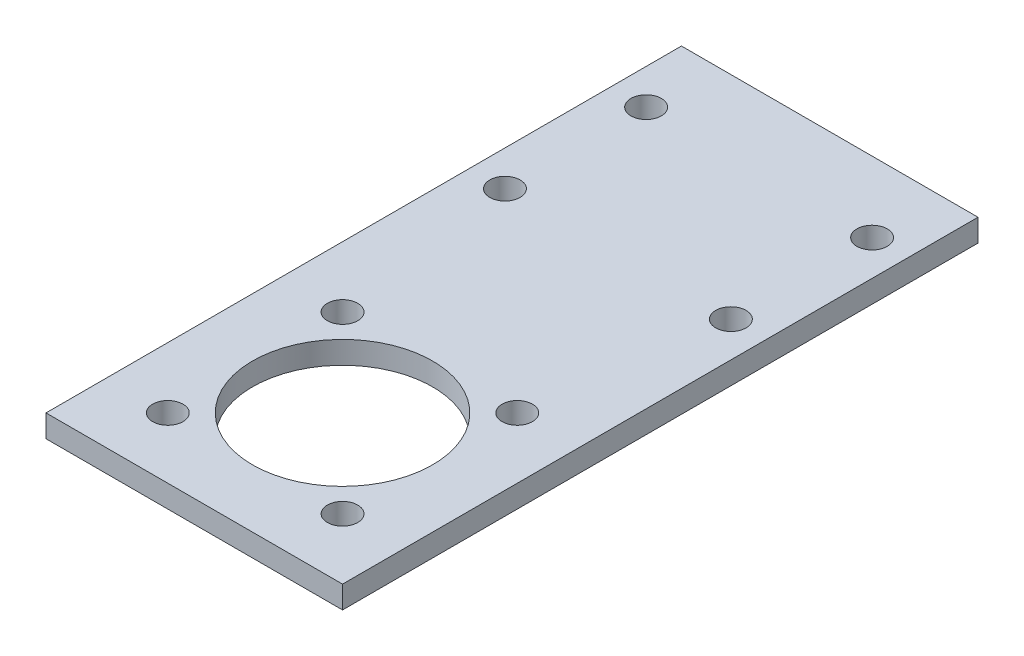
ISO-10303-21;
HEADER;
FILE_DESCRIPTION(('STEP AP214'),'2;1');
FILE_NAME('part.step','',(''),(''),'','','');
FILE_SCHEMA(('AUTOMOTIVE_DESIGN { 1 0 10303 214 1 1 1 1 }'));
ENDSEC;
DATA;
#1=APPLICATION_CONTEXT('core data for automotive mechanical design processes');
#2=APPLICATION_PROTOCOL_DEFINITION('international standard','automotive_design',2000,#1);
#3=PRODUCT_CONTEXT('',#1,'mechanical');
#4=PRODUCT('Part','Part','',(#3));
#5=PRODUCT_RELATED_PRODUCT_CATEGORY('part','',(#4));
#6=PRODUCT_DEFINITION_FORMATION('','',#4);
#7=PRODUCT_DEFINITION_CONTEXT('part definition',#1,'design');
#8=PRODUCT_DEFINITION('design','',#6,#7);
#9=PRODUCT_DEFINITION_SHAPE('','',#8);
#10=(LENGTH_UNIT() NAMED_UNIT(*) SI_UNIT(.MILLI.,.METRE.));
#11=(NAMED_UNIT(*) PLANE_ANGLE_UNIT() SI_UNIT($,.RADIAN.));
#12=(NAMED_UNIT(*) SI_UNIT($,.STERADIAN.) SOLID_ANGLE_UNIT());
#13=UNCERTAINTY_MEASURE_WITH_UNIT(LENGTH_MEASURE(1.E-05),#10,'distance_accuracy_value','');
#14=(GEOMETRIC_REPRESENTATION_CONTEXT(3) GLOBAL_UNCERTAINTY_ASSIGNED_CONTEXT((#13)) GLOBAL_UNIT_ASSIGNED_CONTEXT((#10,
#11,#12)) REPRESENTATION_CONTEXT('',''));
#15=CARTESIAN_POINT('',(0.,0.,0.));
#16=DIRECTION('',(0.,0.,1.));
#17=DIRECTION('',(1.,0.,0.));
#18=AXIS2_PLACEMENT_3D('',#15,#16,#17);
#19=CARTESIAN_POINT('',(0.,0.,0.));
#20=DIRECTION('',(0.,-1.,0.));
#21=DIRECTION('',(0.,0.,-1.));
#22=AXIS2_PLACEMENT_3D('',#19,#20,#21);
#23=PLANE('',#22);
#24=CARTESIAN_POINT('',(21.,0.,-21.));
#25=DIRECTION('',(0.,1.,0.));
#26=DIRECTION('',(0.,0.,1.));
#27=AXIS2_PLACEMENT_3D('',#24,#25,#26);
#28=CIRCLE('',#27,12.75);
#29=CARTESIAN_POINT('',(21.,0.,-8.25000000000001));
#30=VERTEX_POINT('',#29);
#31=EDGE_CURVE('E117',#30,#30,#28,.T.);
#32=ORIENTED_EDGE('',*,*,#31,.T.);
#33=EDGE_LOOP('',(#32));
#34=FACE_BOUND('',#33,.T.);
#35=DIRECTION('',(0.,0.,1.));
#36=VECTOR('',#35,1.);
#37=CARTESIAN_POINT('',(0.,0.,0.));
#38=LINE('',#37,#36);
#39=CARTESIAN_POINT('',(0.,0.,-90.));
#40=VERTEX_POINT('',#39);
#41=CARTESIAN_POINT('',(0.,0.,0.));
#42=VERTEX_POINT('',#41);
#43=EDGE_CURVE('E103',#40,#42,#38,.T.);
#44=ORIENTED_EDGE('',*,*,#43,.F.);
#45=DIRECTION('',(-1.,0.,0.));
#46=VECTOR('',#45,1.);
#47=CARTESIAN_POINT('',(0.,0.,-90.));
#48=LINE('',#47,#46);
#49=CARTESIAN_POINT('',(42.,0.,-90.));
#50=VERTEX_POINT('',#49);
#51=EDGE_CURVE('E78',#50,#40,#48,.T.);
#52=ORIENTED_EDGE('',*,*,#51,.F.);
#53=DIRECTION('',(0.,0.,-1.));
#54=VECTOR('',#53,1.);
#55=CARTESIAN_POINT('',(42.,0.,0.));
#56=LINE('',#55,#54);
#57=CARTESIAN_POINT('',(42.,0.,0.));
#58=VERTEX_POINT('',#57);
#59=EDGE_CURVE('E72',#58,#50,#56,.T.);
#60=ORIENTED_EDGE('',*,*,#59,.F.);
#61=DIRECTION('',(1.,0.,0.));
#62=VECTOR('',#61,1.);
#63=CARTESIAN_POINT('',(0.,0.,0.));
#64=LINE('',#63,#62);
#65=EDGE_CURVE('E95',#42,#58,#64,.T.);
#66=ORIENTED_EDGE('',*,*,#65,.F.);
#67=EDGE_LOOP('',(#44,#52,#60,#66));
#68=FACE_BOUND('',#67,.T.);
#69=CARTESIAN_POINT('',(4.99999999999999,0.,-60.));
#70=DIRECTION('',(0.,1.,0.));
#71=DIRECTION('',(0.,0.,1.));
#72=AXIS2_PLACEMENT_3D('',#69,#70,#71);
#73=CIRCLE('',#72,2.15);
#74=CARTESIAN_POINT('',(4.99999999999999,0.,-57.85));
#75=VERTEX_POINT('',#74);
#76=EDGE_CURVE('E120',#75,#75,#73,.T.);
#77=ORIENTED_EDGE('',*,*,#76,.T.);
#78=EDGE_LOOP('',(#77));
#79=FACE_BOUND('',#78,.T.);
#80=CARTESIAN_POINT('',(37.,0.,-60.));
#81=DIRECTION('',(0.,1.,0.));
#82=DIRECTION('',(0.,0.,1.));
#83=AXIS2_PLACEMENT_3D('',#80,#81,#82);
#84=CIRCLE('',#83,2.15);
#85=CARTESIAN_POINT('',(37.,0.,-57.85));
#86=VERTEX_POINT('',#85);
#87=EDGE_CURVE('E128',#86,#86,#84,.T.);
#88=ORIENTED_EDGE('',*,*,#87,.T.);
#89=EDGE_LOOP('',(#88));
#90=FACE_BOUND('',#89,.T.);
#91=CARTESIAN_POINT('',(37.,0.,-80.));
#92=DIRECTION('',(0.,1.,0.));
#93=DIRECTION('',(0.,0.,1.));
#94=AXIS2_PLACEMENT_3D('',#91,#92,#93);
#95=CIRCLE('',#94,2.15);
#96=CARTESIAN_POINT('',(37.,0.,-77.85));
#97=VERTEX_POINT('',#96);
#98=EDGE_CURVE('E134',#97,#97,#95,.T.);
#99=ORIENTED_EDGE('',*,*,#98,.T.);
#100=EDGE_LOOP('',(#99));
#101=FACE_BOUND('',#100,.T.);
#102=CARTESIAN_POINT('',(8.62563132923542,0.,-8.62563132923542));
#103=DIRECTION('',(0.,1.,0.));
#104=DIRECTION('',(0.,0.,1.));
#105=AXIS2_PLACEMENT_3D('',#102,#103,#104);
#106=CIRCLE('',#105,2.15);
#107=CARTESIAN_POINT('',(8.62563132923542,0.,-6.47563132923543));
#108=VERTEX_POINT('',#107);
#109=EDGE_CURVE('E140',#108,#108,#106,.T.);
#110=ORIENTED_EDGE('',*,*,#109,.T.);
#111=EDGE_LOOP('',(#110));
#112=FACE_BOUND('',#111,.T.);
#113=CARTESIAN_POINT('',(33.3743686707646,0.,-8.62563132923542));
#114=DIRECTION('',(0.,1.,0.));
#115=DIRECTION('',(0.,0.,1.));
#116=AXIS2_PLACEMENT_3D('',#113,#114,#115);
#117=CIRCLE('',#116,2.15);
#118=CARTESIAN_POINT('',(33.3743686707646,0.,-6.47563132923543));
#119=VERTEX_POINT('',#118);
#120=EDGE_CURVE('E146',#119,#119,#117,.T.);
#121=ORIENTED_EDGE('',*,*,#120,.T.);
#122=EDGE_LOOP('',(#121));
#123=FACE_BOUND('',#122,.T.);
#124=CARTESIAN_POINT('',(33.3743686707646,0.,-33.3743686707646));
#125=DIRECTION('',(0.,1.,0.));
#126=DIRECTION('',(0.,0.,1.));
#127=AXIS2_PLACEMENT_3D('',#124,#125,#126);
#128=CIRCLE('',#127,2.15);
#129=CARTESIAN_POINT('',(33.3743686707646,0.,-31.2243686707646));
#130=VERTEX_POINT('',#129);
#131=EDGE_CURVE('E152',#130,#130,#128,.T.);
#132=ORIENTED_EDGE('',*,*,#131,.T.);
#133=EDGE_LOOP('',(#132));
#134=FACE_BOUND('',#133,.T.);
#135=CARTESIAN_POINT('',(4.99999999999998,0.,-80.));
#136=DIRECTION('',(0.,1.,0.));
#137=DIRECTION('',(0.,0.,1.));
#138=AXIS2_PLACEMENT_3D('',#135,#136,#137);
#139=CIRCLE('',#138,2.15);
#140=CARTESIAN_POINT('',(4.99999999999998,0.,-77.85));
#141=VERTEX_POINT('',#140);
#142=EDGE_CURVE('E158',#141,#141,#139,.T.);
#143=ORIENTED_EDGE('',*,*,#142,.T.);
#144=EDGE_LOOP('',(#143));
#145=FACE_BOUND('',#144,.T.);
#146=CARTESIAN_POINT('',(8.62563132923541,0.,-33.3743686707646));
#147=DIRECTION('',(0.,1.,0.));
#148=DIRECTION('',(0.,0.,1.));
#149=AXIS2_PLACEMENT_3D('',#146,#147,#148);
#150=CIRCLE('',#149,2.15);
#151=CARTESIAN_POINT('',(8.62563132923541,0.,-31.2243686707646));
#152=VERTEX_POINT('',#151);
#153=EDGE_CURVE('E164',#152,#152,#150,.T.);
#154=ORIENTED_EDGE('',*,*,#153,.T.);
#155=EDGE_LOOP('',(#154));
#156=FACE_BOUND('',#155,.T.);
#157=ADVANCED_FACE('F38',(#34,#68,#79,#90,#101,#112,#123,#134,#145,#156),#23,.T.);
#158=CARTESIAN_POINT('',(0.,3.175,0.));
#159=DIRECTION('',(0.,-1.,0.));
#160=DIRECTION('',(0.,0.,-1.));
#161=AXIS2_PLACEMENT_3D('',#158,#159,#160);
#162=PLANE('',#161);
#163=CARTESIAN_POINT('',(8.62563132923541,3.175,-33.3743686707646));
#164=DIRECTION('',(0.,1.,0.));
#165=DIRECTION('',(0.,0.,1.));
#166=AXIS2_PLACEMENT_3D('',#163,#164,#165);
#167=CIRCLE('',#166,2.14999999999999);
#168=CARTESIAN_POINT('',(8.62563132923541,3.175,-31.2243686707646));
#169=VERTEX_POINT('',#168);
#170=EDGE_CURVE('E167',#169,#169,#167,.T.);
#171=ORIENTED_EDGE('',*,*,#170,.F.);
#172=EDGE_LOOP('',(#171));
#173=FACE_BOUND('',#172,.T.);
#174=CARTESIAN_POINT('',(4.99999999999998,3.175,-80.));
#175=DIRECTION('',(0.,1.,0.));
#176=DIRECTION('',(0.,0.,1.));
#177=AXIS2_PLACEMENT_3D('',#174,#175,#176);
#178=CIRCLE('',#177,2.14999999999999);
#179=CARTESIAN_POINT('',(4.99999999999998,3.175,-77.85));
#180=VERTEX_POINT('',#179);
#181=EDGE_CURVE('E161',#180,#180,#178,.T.);
#182=ORIENTED_EDGE('',*,*,#181,.F.);
#183=EDGE_LOOP('',(#182));
#184=FACE_BOUND('',#183,.T.);
#185=CARTESIAN_POINT('',(33.3743686707646,3.175,-33.3743686707646));
#186=DIRECTION('',(0.,1.,0.));
#187=DIRECTION('',(0.,0.,1.));
#188=AXIS2_PLACEMENT_3D('',#185,#186,#187);
#189=CIRCLE('',#188,2.14999999999999);
#190=CARTESIAN_POINT('',(33.3743686707646,3.175,-31.2243686707646));
#191=VERTEX_POINT('',#190);
#192=EDGE_CURVE('E155',#191,#191,#189,.T.);
#193=ORIENTED_EDGE('',*,*,#192,.F.);
#194=EDGE_LOOP('',(#193));
#195=FACE_BOUND('',#194,.T.);
#196=CARTESIAN_POINT('',(33.3743686707646,3.175,-8.62563132923542));
#197=DIRECTION('',(0.,1.,0.));
#198=DIRECTION('',(0.,0.,1.));
#199=AXIS2_PLACEMENT_3D('',#196,#197,#198);
#200=CIRCLE('',#199,2.14999999999999);
#201=CARTESIAN_POINT('',(33.3743686707646,3.175,-6.47563132923544));
#202=VERTEX_POINT('',#201);
#203=EDGE_CURVE('E149',#202,#202,#200,.T.);
#204=ORIENTED_EDGE('',*,*,#203,.F.);
#205=EDGE_LOOP('',(#204));
#206=FACE_BOUND('',#205,.T.);
#207=CARTESIAN_POINT('',(8.62563132923542,3.175,-8.62563132923542));
#208=DIRECTION('',(0.,1.,0.));
#209=DIRECTION('',(0.,0.,1.));
#210=AXIS2_PLACEMENT_3D('',#207,#208,#209);
#211=CIRCLE('',#210,2.14999999999999);
#212=CARTESIAN_POINT('',(8.62563132923542,3.175,-6.47563132923544));
#213=VERTEX_POINT('',#212);
#214=EDGE_CURVE('E143',#213,#213,#211,.T.);
#215=ORIENTED_EDGE('',*,*,#214,.F.);
#216=EDGE_LOOP('',(#215));
#217=FACE_BOUND('',#216,.T.);
#218=CARTESIAN_POINT('',(37.,3.175,-80.));
#219=DIRECTION('',(0.,1.,0.));
#220=DIRECTION('',(0.,0.,1.));
#221=AXIS2_PLACEMENT_3D('',#218,#219,#220);
#222=CIRCLE('',#221,2.14999999999999);
#223=CARTESIAN_POINT('',(37.,3.175,-77.85));
#224=VERTEX_POINT('',#223);
#225=EDGE_CURVE('E137',#224,#224,#222,.T.);
#226=ORIENTED_EDGE('',*,*,#225,.F.);
#227=EDGE_LOOP('',(#226));
#228=FACE_BOUND('',#227,.T.);
#229=CARTESIAN_POINT('',(37.,3.175,-60.));
#230=DIRECTION('',(0.,1.,0.));
#231=DIRECTION('',(0.,0.,1.));
#232=AXIS2_PLACEMENT_3D('',#229,#230,#231);
#233=CIRCLE('',#232,2.14999999999999);
#234=CARTESIAN_POINT('',(37.,3.175,-57.85));
#235=VERTEX_POINT('',#234);
#236=EDGE_CURVE('E131',#235,#235,#233,.T.);
#237=ORIENTED_EDGE('',*,*,#236,.F.);
#238=EDGE_LOOP('',(#237));
#239=FACE_BOUND('',#238,.T.);
#240=CARTESIAN_POINT('',(4.99999999999999,3.175,-60.));
#241=DIRECTION('',(0.,1.,0.));
#242=DIRECTION('',(0.,0.,1.));
#243=AXIS2_PLACEMENT_3D('',#240,#241,#242);
#244=CIRCLE('',#243,2.14999999999999);
#245=CARTESIAN_POINT('',(4.99999999999999,3.175,-57.85));
#246=VERTEX_POINT('',#245);
#247=EDGE_CURVE('E125',#246,#246,#244,.T.);
#248=ORIENTED_EDGE('',*,*,#247,.F.);
#249=EDGE_LOOP('',(#248));
#250=FACE_BOUND('',#249,.T.);
#251=DIRECTION('',(0.,0.,1.));
#252=VECTOR('',#251,1.);
#253=CARTESIAN_POINT('',(0.,3.175,0.));
#254=LINE('',#253,#252);
#255=CARTESIAN_POINT('',(0.,3.175,-90.));
#256=VERTEX_POINT('',#255);
#257=CARTESIAN_POINT('',(0.,3.175,0.));
#258=VERTEX_POINT('',#257);
#259=EDGE_CURVE('E91',#256,#258,#254,.T.);
#260=ORIENTED_EDGE('',*,*,#259,.T.);
#261=DIRECTION('',(1.,0.,0.));
#262=VECTOR('',#261,1.);
#263=CARTESIAN_POINT('',(0.,3.175,0.));
#264=LINE('',#263,#262);
#265=CARTESIAN_POINT('',(42.,3.175,0.));
#266=VERTEX_POINT('',#265);
#267=EDGE_CURVE('E85',#258,#266,#264,.T.);
#268=ORIENTED_EDGE('',*,*,#267,.T.);
#269=DIRECTION('',(0.,0.,-1.));
#270=VECTOR('',#269,1.);
#271=CARTESIAN_POINT('',(42.,3.175,0.));
#272=LINE('',#271,#270);
#273=CARTESIAN_POINT('',(42.,3.175,-90.));
#274=VERTEX_POINT('',#273);
#275=EDGE_CURVE('E89',#266,#274,#272,.T.);
#276=ORIENTED_EDGE('',*,*,#275,.T.);
#277=DIRECTION('',(-1.,0.,0.));
#278=VECTOR('',#277,1.);
#279=CARTESIAN_POINT('',(0.,3.175,-90.));
#280=LINE('',#279,#278);
#281=EDGE_CURVE('E55',#274,#256,#280,.T.);
#282=ORIENTED_EDGE('',*,*,#281,.T.);
#283=EDGE_LOOP('',(#260,#268,#276,#282));
#284=FACE_BOUND('',#283,.T.);
#285=CARTESIAN_POINT('',(21.,3.175,-21.));
#286=DIRECTION('',(0.,1.,0.));
#287=DIRECTION('',(0.,0.,1.));
#288=AXIS2_PLACEMENT_3D('',#285,#286,#287);
#289=CIRCLE('',#288,12.75);
#290=CARTESIAN_POINT('',(21.,3.175,-8.25000000000001));
#291=VERTEX_POINT('',#290);
#292=EDGE_CURVE('E106',#291,#291,#289,.T.);
#293=ORIENTED_EDGE('',*,*,#292,.F.);
#294=EDGE_LOOP('',(#293));
#295=FACE_BOUND('',#294,.T.);
#296=ADVANCED_FACE('F86',(#173,#184,#195,#206,#217,#228,#239,#250,#284,#295),#162,.F.);
#297=CARTESIAN_POINT('',(0.,3.175,0.));
#298=DIRECTION('',(1.,0.,0.));
#299=DIRECTION('',(0.,0.,-1.));
#300=AXIS2_PLACEMENT_3D('',#297,#298,#299);
#301=PLANE('',#300);
#302=ORIENTED_EDGE('',*,*,#43,.T.);
#303=DIRECTION('',(0.,-1.,0.));
#304=VECTOR('',#303,1.);
#305=CARTESIAN_POINT('',(0.,3.175,0.));
#306=LINE('',#305,#304);
#307=EDGE_CURVE('E11',#258,#42,#306,.T.);
#308=ORIENTED_EDGE('',*,*,#307,.F.);
#309=ORIENTED_EDGE('',*,*,#259,.F.);
#310=DIRECTION('',(0.,-1.,0.));
#311=VECTOR('',#310,1.);
#312=CARTESIAN_POINT('',(0.,3.175,-90.));
#313=LINE('',#312,#311);
#314=EDGE_CURVE('E99',#256,#40,#313,.T.);
#315=ORIENTED_EDGE('',*,*,#314,.T.);
#316=EDGE_LOOP('',(#302,#308,#309,#315));
#317=FACE_BOUND('',#316,.T.);
#318=ADVANCED_FACE('F40',(#317),#301,.F.);
#319=CARTESIAN_POINT('',(0.,3.175,0.));
#320=DIRECTION('',(0.,0.,-1.));
#321=DIRECTION('',(-1.,0.,0.));
#322=AXIS2_PLACEMENT_3D('',#319,#320,#321);
#323=PLANE('',#322);
#324=ORIENTED_EDGE('',*,*,#65,.T.);
#325=DIRECTION('',(0.,-1.,0.));
#326=VECTOR('',#325,1.);
#327=CARTESIAN_POINT('',(42.,3.175,0.));
#328=LINE('',#327,#326);
#329=EDGE_CURVE('E47',#266,#58,#328,.T.);
#330=ORIENTED_EDGE('',*,*,#329,.F.);
#331=ORIENTED_EDGE('',*,*,#267,.F.);
#332=ORIENTED_EDGE('',*,*,#307,.T.);
#333=EDGE_LOOP('',(#324,#330,#331,#332));
#334=FACE_BOUND('',#333,.T.);
#335=ADVANCED_FACE('F94',(#334),#323,.F.);
#336=CARTESIAN_POINT('',(42.,3.175,0.));
#337=DIRECTION('',(-1.,0.,0.));
#338=DIRECTION('',(0.,0.,1.));
#339=AXIS2_PLACEMENT_3D('',#336,#337,#338);
#340=PLANE('',#339);
#341=ORIENTED_EDGE('',*,*,#59,.T.);
#342=DIRECTION('',(0.,-1.,0.));
#343=VECTOR('',#342,1.);
#344=CARTESIAN_POINT('',(42.,3.175,-90.));
#345=LINE('',#344,#343);
#346=EDGE_CURVE('E96',#274,#50,#345,.T.);
#347=ORIENTED_EDGE('',*,*,#346,.F.);
#348=ORIENTED_EDGE('',*,*,#275,.F.);
#349=ORIENTED_EDGE('',*,*,#329,.T.);
#350=EDGE_LOOP('',(#341,#347,#348,#349));
#351=FACE_BOUND('',#350,.T.);
#352=ADVANCED_FACE('F97',(#351),#340,.F.);
#353=CARTESIAN_POINT('',(0.,3.175,-90.));
#354=DIRECTION('',(0.,0.,1.));
#355=DIRECTION('',(1.,0.,0.));
#356=AXIS2_PLACEMENT_3D('',#353,#354,#355);
#357=PLANE('',#356);
#358=ORIENTED_EDGE('',*,*,#51,.T.);
#359=ORIENTED_EDGE('',*,*,#314,.F.);
#360=ORIENTED_EDGE('',*,*,#281,.F.);
#361=ORIENTED_EDGE('',*,*,#346,.T.);
#362=EDGE_LOOP('',(#358,#359,#360,#361));
#363=FACE_BOUND('',#362,.T.);
#364=ADVANCED_FACE('F111',(#363),#357,.F.);
#365=CARTESIAN_POINT('',(21.,3.175,-21.));
#366=DIRECTION('',(0.,-1.,0.));
#367=DIRECTION('',(0.,0.,-1.));
#368=AXIS2_PLACEMENT_3D('',#365,#366,#367);
#369=CYLINDRICAL_SURFACE('',#368,12.75);
#370=ORIENTED_EDGE('',*,*,#292,.T.);
#371=EDGE_LOOP('',(#370));
#372=FACE_BOUND('',#371,.T.);
#373=ORIENTED_EDGE('',*,*,#31,.F.);
#374=EDGE_LOOP('',(#373));
#375=FACE_BOUND('',#374,.T.);
#376=ADVANCED_FACE('F193',(#372,#375),#369,.F.);
#377=CARTESIAN_POINT('',(4.99999999999999,3.175,-60.));
#378=DIRECTION('',(0.,1.,0.));
#379=DIRECTION('',(0.,0.,1.));
#380=AXIS2_PLACEMENT_3D('',#377,#378,#379);
#381=CYLINDRICAL_SURFACE('',#380,2.14999999999999);
#382=ORIENTED_EDGE('',*,*,#76,.F.);
#383=EDGE_LOOP('',(#382));
#384=FACE_BOUND('',#383,.T.);
#385=ORIENTED_EDGE('',*,*,#247,.T.);
#386=EDGE_LOOP('',(#385));
#387=FACE_BOUND('',#386,.T.);
#388=ADVANCED_FACE('F190',(#384,#387),#381,.F.);
#389=CARTESIAN_POINT('',(37.,3.175,-60.));
#390=DIRECTION('',(0.,1.,0.));
#391=DIRECTION('',(0.,0.,1.));
#392=AXIS2_PLACEMENT_3D('',#389,#390,#391);
#393=CYLINDRICAL_SURFACE('',#392,2.14999999999999);
#394=ORIENTED_EDGE('',*,*,#87,.F.);
#395=EDGE_LOOP('',(#394));
#396=FACE_BOUND('',#395,.T.);
#397=ORIENTED_EDGE('',*,*,#236,.T.);
#398=EDGE_LOOP('',(#397));
#399=FACE_BOUND('',#398,.T.);
#400=ADVANCED_FACE('F192',(#396,#399),#393,.F.);
#401=CARTESIAN_POINT('',(37.,3.175,-80.));
#402=DIRECTION('',(0.,1.,0.));
#403=DIRECTION('',(0.,0.,1.));
#404=AXIS2_PLACEMENT_3D('',#401,#402,#403);
#405=CYLINDRICAL_SURFACE('',#404,2.14999999999999);
#406=ORIENTED_EDGE('',*,*,#98,.F.);
#407=EDGE_LOOP('',(#406));
#408=FACE_BOUND('',#407,.T.);
#409=ORIENTED_EDGE('',*,*,#225,.T.);
#410=EDGE_LOOP('',(#409));
#411=FACE_BOUND('',#410,.T.);
#412=ADVANCED_FACE('F199',(#408,#411),#405,.F.);
#413=CARTESIAN_POINT('',(8.62563132923542,3.175,-8.62563132923542));
#414=DIRECTION('',(0.,1.,0.));
#415=DIRECTION('',(0.,0.,1.));
#416=AXIS2_PLACEMENT_3D('',#413,#414,#415);
#417=CYLINDRICAL_SURFACE('',#416,2.14999999999999);
#418=ORIENTED_EDGE('',*,*,#109,.F.);
#419=EDGE_LOOP('',(#418));
#420=FACE_BOUND('',#419,.T.);
#421=ORIENTED_EDGE('',*,*,#214,.T.);
#422=EDGE_LOOP('',(#421));
#423=FACE_BOUND('',#422,.T.);
#424=ADVANCED_FACE('F271',(#420,#423),#417,.F.);
#425=CARTESIAN_POINT('',(33.3743686707646,3.175,-8.62563132923542));
#426=DIRECTION('',(0.,1.,0.));
#427=DIRECTION('',(0.,0.,1.));
#428=AXIS2_PLACEMENT_3D('',#425,#426,#427);
#429=CYLINDRICAL_SURFACE('',#428,2.14999999999999);
#430=ORIENTED_EDGE('',*,*,#120,.F.);
#431=EDGE_LOOP('',(#430));
#432=FACE_BOUND('',#431,.T.);
#433=ORIENTED_EDGE('',*,*,#203,.T.);
#434=EDGE_LOOP('',(#433));
#435=FACE_BOUND('',#434,.T.);
#436=ADVANCED_FACE('F281',(#432,#435),#429,.F.);
#437=CARTESIAN_POINT('',(33.3743686707646,3.175,-33.3743686707646));
#438=DIRECTION('',(0.,1.,0.));
#439=DIRECTION('',(0.,0.,1.));
#440=AXIS2_PLACEMENT_3D('',#437,#438,#439);
#441=CYLINDRICAL_SURFACE('',#440,2.14999999999999);
#442=ORIENTED_EDGE('',*,*,#131,.F.);
#443=EDGE_LOOP('',(#442));
#444=FACE_BOUND('',#443,.T.);
#445=ORIENTED_EDGE('',*,*,#192,.T.);
#446=EDGE_LOOP('',(#445));
#447=FACE_BOUND('',#446,.T.);
#448=ADVANCED_FACE('F291',(#444,#447),#441,.F.);
#449=CARTESIAN_POINT('',(4.99999999999998,3.175,-80.));
#450=DIRECTION('',(0.,1.,0.));
#451=DIRECTION('',(0.,0.,1.));
#452=AXIS2_PLACEMENT_3D('',#449,#450,#451);
#453=CYLINDRICAL_SURFACE('',#452,2.14999999999999);
#454=ORIENTED_EDGE('',*,*,#142,.F.);
#455=EDGE_LOOP('',(#454));
#456=FACE_BOUND('',#455,.T.);
#457=ORIENTED_EDGE('',*,*,#181,.T.);
#458=EDGE_LOOP('',(#457));
#459=FACE_BOUND('',#458,.T.);
#460=ADVANCED_FACE('F301',(#456,#459),#453,.F.);
#461=CARTESIAN_POINT('',(8.62563132923541,3.175,-33.3743686707646));
#462=DIRECTION('',(0.,1.,0.));
#463=DIRECTION('',(0.,0.,1.));
#464=AXIS2_PLACEMENT_3D('',#461,#462,#463);
#465=CYLINDRICAL_SURFACE('',#464,2.14999999999999);
#466=ORIENTED_EDGE('',*,*,#153,.F.);
#467=EDGE_LOOP('',(#466));
#468=FACE_BOUND('',#467,.T.);
#469=ORIENTED_EDGE('',*,*,#170,.T.);
#470=EDGE_LOOP('',(#469));
#471=FACE_BOUND('',#470,.T.);
#472=ADVANCED_FACE('F171',(#468,#471),#465,.F.);
#473=CLOSED_SHELL('',(#157,#296,#318,#335,#352,#364,#376,#388,#400,#412,#424,#436,#448,#460,#472));
#474=MANIFOLD_SOLID_BREP('B2',#473);
#475=ADVANCED_BREP_SHAPE_REPRESENTATION('',(#18,#474),#14);
#476=SHAPE_DEFINITION_REPRESENTATION(#9,#475);
ENDSEC;
END-ISO-10303-21;
